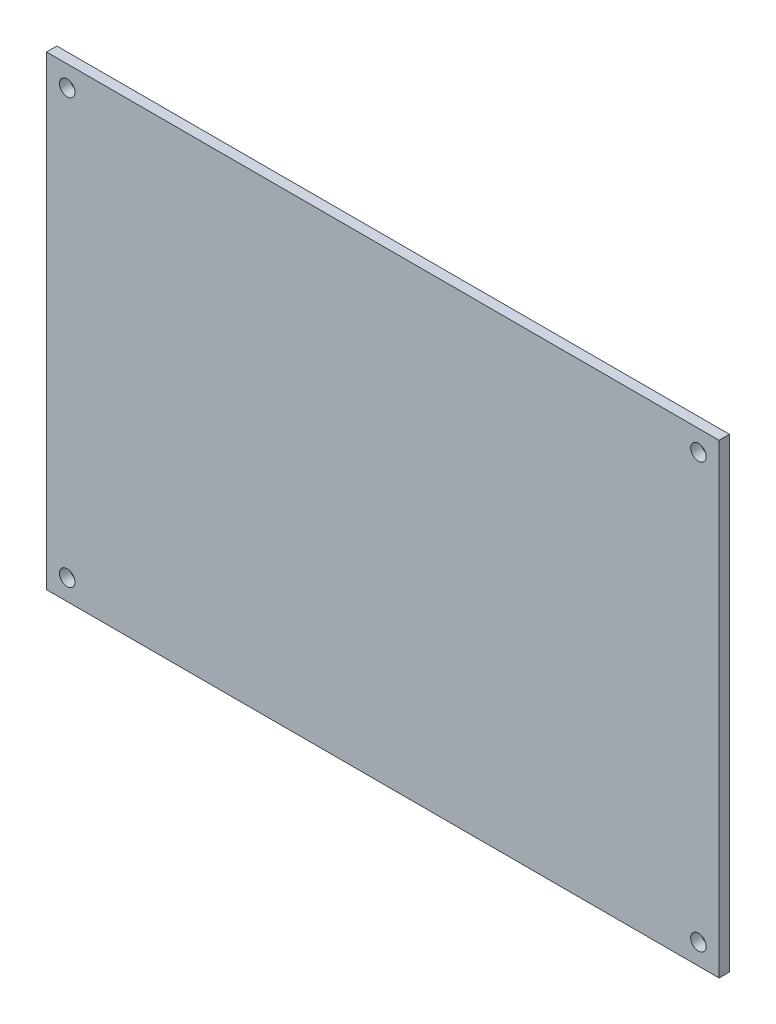
ISO-10303-21;
HEADER;
FILE_DESCRIPTION(('STEP AP214'),'2;1');
FILE_NAME('part.step','',(''),(''),'','','');
FILE_SCHEMA(('AUTOMOTIVE_DESIGN { 1 0 10303 214 1 1 1 1 }'));
ENDSEC;
DATA;
#1=APPLICATION_CONTEXT('core data for automotive mechanical design processes');
#2=APPLICATION_PROTOCOL_DEFINITION('international standard','automotive_design',2000,#1);
#3=PRODUCT_CONTEXT('',#1,'mechanical');
#4=PRODUCT('Part','Part','',(#3));
#5=PRODUCT_RELATED_PRODUCT_CATEGORY('part','',(#4));
#6=PRODUCT_DEFINITION_FORMATION('','',#4);
#7=PRODUCT_DEFINITION_CONTEXT('part definition',#1,'design');
#8=PRODUCT_DEFINITION('design','',#6,#7);
#9=PRODUCT_DEFINITION_SHAPE('','',#8);
#10=(LENGTH_UNIT() NAMED_UNIT(*) SI_UNIT(.MILLI.,.METRE.));
#11=(NAMED_UNIT(*) PLANE_ANGLE_UNIT() SI_UNIT($,.RADIAN.));
#12=(NAMED_UNIT(*) SI_UNIT($,.STERADIAN.) SOLID_ANGLE_UNIT());
#13=UNCERTAINTY_MEASURE_WITH_UNIT(LENGTH_MEASURE(1.E-05),#10,'distance_accuracy_value','');
#14=(GEOMETRIC_REPRESENTATION_CONTEXT(3) GLOBAL_UNCERTAINTY_ASSIGNED_CONTEXT((#13)) GLOBAL_UNIT_ASSIGNED_CONTEXT((#10,
#11,#12)) REPRESENTATION_CONTEXT('',''));
#15=CARTESIAN_POINT('',(0.,0.,0.));
#16=DIRECTION('',(0.,0.,1.));
#17=DIRECTION('',(1.,0.,0.));
#18=AXIS2_PLACEMENT_3D('',#15,#16,#17);
#19=CARTESIAN_POINT('',(0.,114.3,2.54));
#20=DIRECTION('',(0.,0.,-1.));
#21=DIRECTION('',(-1.,0.,0.));
#22=AXIS2_PLACEMENT_3D('',#19,#20,#21);
#23=PLANE('',#22);
#24=CARTESIAN_POINT('',(160.02,5.08,2.54));
#25=DIRECTION('',(0.,0.,1.));
#26=DIRECTION('',(1.,0.,0.));
#27=AXIS2_PLACEMENT_3D('',#24,#25,#26);
#28=CIRCLE('',#27,1.90499999999999);
#29=CARTESIAN_POINT('',(161.925,5.08,2.54));
#30=VERTEX_POINT('',#29);
#31=EDGE_CURVE('E131',#30,#30,#28,.T.);
#32=ORIENTED_EDGE('',*,*,#31,.F.);
#33=EDGE_LOOP('',(#32));
#34=FACE_BOUND('',#33,.T.);
#35=CARTESIAN_POINT('',(5.08,109.22,2.54));
#36=DIRECTION('',(0.,0.,1.));
#37=DIRECTION('',(1.,0.,0.));
#38=AXIS2_PLACEMENT_3D('',#35,#36,#37);
#39=CIRCLE('',#38,1.905);
#40=CARTESIAN_POINT('',(6.985,109.22,2.54));
#41=VERTEX_POINT('',#40);
#42=EDGE_CURVE('E93',#41,#41,#39,.T.);
#43=ORIENTED_EDGE('',*,*,#42,.F.);
#44=EDGE_LOOP('',(#43));
#45=FACE_BOUND('',#44,.T.);
#46=DIRECTION('',(0.,-1.,0.));
#47=VECTOR('',#46,1.);
#48=CARTESIAN_POINT('',(0.,0.,2.54));
#49=LINE('',#48,#47);
#50=CARTESIAN_POINT('',(0.,114.3,2.54));
#51=VERTEX_POINT('',#50);
#52=CARTESIAN_POINT('',(0.,0.,2.54));
#53=VERTEX_POINT('',#52);
#54=EDGE_CURVE('E103',#51,#53,#49,.T.);
#55=ORIENTED_EDGE('',*,*,#54,.T.);
#56=DIRECTION('',(1.,0.,0.));
#57=VECTOR('',#56,1.);
#58=CARTESIAN_POINT('',(0.,0.,2.54));
#59=LINE('',#58,#57);
#60=CARTESIAN_POINT('',(165.1,0.,2.54));
#61=VERTEX_POINT('',#60);
#62=EDGE_CURVE('E88',#53,#61,#59,.T.);
#63=ORIENTED_EDGE('',*,*,#62,.T.);
#64=DIRECTION('',(0.,1.,0.));
#65=VECTOR('',#64,1.);
#66=CARTESIAN_POINT('',(165.1,0.,2.54));
#67=LINE('',#66,#65);
#68=CARTESIAN_POINT('',(165.1,114.3,2.54));
#69=VERTEX_POINT('',#68);
#70=EDGE_CURVE('E54',#61,#69,#67,.T.);
#71=ORIENTED_EDGE('',*,*,#70,.T.);
#72=DIRECTION('',(-1.,0.,0.));
#73=VECTOR('',#72,1.);
#74=CARTESIAN_POINT('',(0.,114.3,2.54));
#75=LINE('',#74,#73);
#76=EDGE_CURVE('E49',#69,#51,#75,.T.);
#77=ORIENTED_EDGE('',*,*,#76,.T.);
#78=EDGE_LOOP('',(#55,#63,#71,#77));
#79=FACE_BOUND('',#78,.T.);
#80=CARTESIAN_POINT('',(160.02,109.22,2.54));
#81=DIRECTION('',(0.,0.,1.));
#82=DIRECTION('',(1.,0.,0.));
#83=AXIS2_PLACEMENT_3D('',#80,#81,#82);
#84=CIRCLE('',#83,1.90499999999999);
#85=CARTESIAN_POINT('',(161.925,109.22,2.54));
#86=VERTEX_POINT('',#85);
#87=EDGE_CURVE('E122',#86,#86,#84,.T.);
#88=ORIENTED_EDGE('',*,*,#87,.F.);
#89=EDGE_LOOP('',(#88));
#90=FACE_BOUND('',#89,.T.);
#91=CARTESIAN_POINT('',(5.08,5.08,2.54));
#92=DIRECTION('',(0.,0.,1.));
#93=DIRECTION('',(1.,0.,0.));
#94=AXIS2_PLACEMENT_3D('',#91,#92,#93);
#95=CIRCLE('',#94,1.905);
#96=CARTESIAN_POINT('',(6.985,5.08,2.54));
#97=VERTEX_POINT('',#96);
#98=EDGE_CURVE('E125',#97,#97,#95,.T.);
#99=ORIENTED_EDGE('',*,*,#98,.F.);
#100=EDGE_LOOP('',(#99));
#101=FACE_BOUND('',#100,.T.);
#102=ADVANCED_FACE('F34',(#34,#45,#79,#90,#101),#23,.F.);
#103=CARTESIAN_POINT('',(0.,114.3,0.));
#104=DIRECTION('',(0.,0.,-1.));
#105=DIRECTION('',(-1.,0.,0.));
#106=AXIS2_PLACEMENT_3D('',#103,#104,#105);
#107=PLANE('',#106);
#108=CARTESIAN_POINT('',(160.02,5.08,0.));
#109=DIRECTION('',(0.,0.,1.));
#110=DIRECTION('',(1.,0.,0.));
#111=AXIS2_PLACEMENT_3D('',#108,#109,#110);
#112=CIRCLE('',#111,1.90499999999999);
#113=CARTESIAN_POINT('',(161.925,5.08,0.));
#114=VERTEX_POINT('',#113);
#115=EDGE_CURVE('E127',#114,#114,#112,.T.);
#116=ORIENTED_EDGE('',*,*,#115,.T.);
#117=EDGE_LOOP('',(#116));
#118=FACE_BOUND('',#117,.T.);
#119=CARTESIAN_POINT('',(5.08,109.22,0.));
#120=DIRECTION('',(0.,0.,1.));
#121=DIRECTION('',(1.,0.,0.));
#122=AXIS2_PLACEMENT_3D('',#119,#120,#121);
#123=CIRCLE('',#122,1.905);
#124=CARTESIAN_POINT('',(6.985,109.22,0.));
#125=VERTEX_POINT('',#124);
#126=EDGE_CURVE('E96',#125,#125,#123,.T.);
#127=ORIENTED_EDGE('',*,*,#126,.T.);
#128=EDGE_LOOP('',(#127));
#129=FACE_BOUND('',#128,.T.);
#130=DIRECTION('',(0.,-1.,0.));
#131=VECTOR('',#130,1.);
#132=CARTESIAN_POINT('',(0.,0.,0.));
#133=LINE('',#132,#131);
#134=CARTESIAN_POINT('',(0.,114.3,0.));
#135=VERTEX_POINT('',#134);
#136=CARTESIAN_POINT('',(0.,0.,0.));
#137=VERTEX_POINT('',#136);
#138=EDGE_CURVE('E80',#135,#137,#133,.T.);
#139=ORIENTED_EDGE('',*,*,#138,.F.);
#140=DIRECTION('',(-1.,0.,0.));
#141=VECTOR('',#140,1.);
#142=CARTESIAN_POINT('',(0.,114.3,0.));
#143=LINE('',#142,#141);
#144=CARTESIAN_POINT('',(165.1,114.3,0.));
#145=VERTEX_POINT('',#144);
#146=EDGE_CURVE('E101',#145,#135,#143,.T.);
#147=ORIENTED_EDGE('',*,*,#146,.F.);
#148=DIRECTION('',(0.,1.,0.));
#149=VECTOR('',#148,1.);
#150=CARTESIAN_POINT('',(165.1,0.,0.));
#151=LINE('',#150,#149);
#152=CARTESIAN_POINT('',(165.1,0.,0.));
#153=VERTEX_POINT('',#152);
#154=EDGE_CURVE('E81',#153,#145,#151,.T.);
#155=ORIENTED_EDGE('',*,*,#154,.F.);
#156=DIRECTION('',(1.,0.,0.));
#157=VECTOR('',#156,1.);
#158=CARTESIAN_POINT('',(0.,0.,0.));
#159=LINE('',#158,#157);
#160=EDGE_CURVE('E75',#137,#153,#159,.T.);
#161=ORIENTED_EDGE('',*,*,#160,.F.);
#162=EDGE_LOOP('',(#139,#147,#155,#161));
#163=FACE_BOUND('',#162,.T.);
#164=CARTESIAN_POINT('',(160.02,109.22,0.));
#165=DIRECTION('',(0.,0.,1.));
#166=DIRECTION('',(1.,0.,0.));
#167=AXIS2_PLACEMENT_3D('',#164,#165,#166);
#168=CIRCLE('',#167,1.90499999999999);
#169=CARTESIAN_POINT('',(161.925,109.22,0.));
#170=VERTEX_POINT('',#169);
#171=EDGE_CURVE('E138',#170,#170,#168,.T.);
#172=ORIENTED_EDGE('',*,*,#171,.T.);
#173=EDGE_LOOP('',(#172));
#174=FACE_BOUND('',#173,.T.);
#175=CARTESIAN_POINT('',(5.08,5.08,0.));
#176=DIRECTION('',(0.,0.,1.));
#177=DIRECTION('',(1.,0.,0.));
#178=AXIS2_PLACEMENT_3D('',#175,#176,#177);
#179=CIRCLE('',#178,1.905);
#180=CARTESIAN_POINT('',(6.985,5.08,0.));
#181=VERTEX_POINT('',#180);
#182=EDGE_CURVE('E128',#181,#181,#179,.T.);
#183=ORIENTED_EDGE('',*,*,#182,.T.);
#184=EDGE_LOOP('',(#183));
#185=FACE_BOUND('',#184,.T.);
#186=ADVANCED_FACE('F76',(#118,#129,#163,#174,#185),#107,.T.);
#187=CARTESIAN_POINT('',(0.,0.,2.54));
#188=DIRECTION('',(1.,0.,0.));
#189=DIRECTION('',(0.,0.,-1.));
#190=AXIS2_PLACEMENT_3D('',#187,#188,#189);
#191=PLANE('',#190);
#192=ORIENTED_EDGE('',*,*,#138,.T.);
#193=DIRECTION('',(0.,0.,-1.));
#194=VECTOR('',#193,1.);
#195=CARTESIAN_POINT('',(0.,0.,2.54));
#196=LINE('',#195,#194);
#197=EDGE_CURVE('E11',#53,#137,#196,.T.);
#198=ORIENTED_EDGE('',*,*,#197,.F.);
#199=ORIENTED_EDGE('',*,*,#54,.F.);
#200=DIRECTION('',(0.,0.,-1.));
#201=VECTOR('',#200,1.);
#202=CARTESIAN_POINT('',(0.,114.3,2.54));
#203=LINE('',#202,#201);
#204=EDGE_CURVE('E92',#51,#135,#203,.T.);
#205=ORIENTED_EDGE('',*,*,#204,.T.);
#206=EDGE_LOOP('',(#192,#198,#199,#205));
#207=FACE_BOUND('',#206,.T.);
#208=ADVANCED_FACE('F36',(#207),#191,.F.);
#209=CARTESIAN_POINT('',(0.,0.,2.54));
#210=DIRECTION('',(0.,1.,0.));
#211=DIRECTION('',(0.,0.,1.));
#212=AXIS2_PLACEMENT_3D('',#209,#210,#211);
#213=PLANE('',#212);
#214=ORIENTED_EDGE('',*,*,#160,.T.);
#215=DIRECTION('',(0.,0.,-1.));
#216=VECTOR('',#215,1.);
#217=CARTESIAN_POINT('',(165.1,0.,2.54));
#218=LINE('',#217,#216);
#219=EDGE_CURVE('E42',#61,#153,#218,.T.);
#220=ORIENTED_EDGE('',*,*,#219,.F.);
#221=ORIENTED_EDGE('',*,*,#62,.F.);
#222=ORIENTED_EDGE('',*,*,#197,.T.);
#223=EDGE_LOOP('',(#214,#220,#221,#222));
#224=FACE_BOUND('',#223,.T.);
#225=ADVANCED_FACE('F87',(#224),#213,.F.);
#226=CARTESIAN_POINT('',(165.1,0.,2.54));
#227=DIRECTION('',(-1.,0.,0.));
#228=DIRECTION('',(0.,0.,1.));
#229=AXIS2_PLACEMENT_3D('',#226,#227,#228);
#230=PLANE('',#229);
#231=ORIENTED_EDGE('',*,*,#154,.T.);
#232=DIRECTION('',(0.,0.,-1.));
#233=VECTOR('',#232,1.);
#234=CARTESIAN_POINT('',(165.1,114.3,2.54));
#235=LINE('',#234,#233);
#236=EDGE_CURVE('E109',#69,#145,#235,.T.);
#237=ORIENTED_EDGE('',*,*,#236,.F.);
#238=ORIENTED_EDGE('',*,*,#70,.F.);
#239=ORIENTED_EDGE('',*,*,#219,.T.);
#240=EDGE_LOOP('',(#231,#237,#238,#239));
#241=FACE_BOUND('',#240,.T.);
#242=ADVANCED_FACE('F112',(#241),#230,.F.);
#243=CARTESIAN_POINT('',(0.,114.3,2.54));
#244=DIRECTION('',(0.,-1.,0.));
#245=DIRECTION('',(0.,0.,-1.));
#246=AXIS2_PLACEMENT_3D('',#243,#244,#245);
#247=PLANE('',#246);
#248=ORIENTED_EDGE('',*,*,#146,.T.);
#249=ORIENTED_EDGE('',*,*,#204,.F.);
#250=ORIENTED_EDGE('',*,*,#76,.F.);
#251=ORIENTED_EDGE('',*,*,#236,.T.);
#252=EDGE_LOOP('',(#248,#249,#250,#251));
#253=FACE_BOUND('',#252,.T.);
#254=ADVANCED_FACE('F114',(#253),#247,.F.);
#255=CARTESIAN_POINT('',(5.08,109.22,2.54));
#256=DIRECTION('',(0.,0.,-1.));
#257=DIRECTION('',(-1.,0.,0.));
#258=AXIS2_PLACEMENT_3D('',#255,#256,#257);
#259=CYLINDRICAL_SURFACE('',#258,1.905);
#260=ORIENTED_EDGE('',*,*,#42,.T.);
#261=EDGE_LOOP('',(#260));
#262=FACE_BOUND('',#261,.T.);
#263=ORIENTED_EDGE('',*,*,#126,.F.);
#264=EDGE_LOOP('',(#263));
#265=FACE_BOUND('',#264,.T.);
#266=ADVANCED_FACE('F145',(#262,#265),#259,.F.);
#267=CARTESIAN_POINT('',(160.02,109.22,2.54));
#268=DIRECTION('',(0.,0.,-1.));
#269=DIRECTION('',(-1.,0.,0.));
#270=AXIS2_PLACEMENT_3D('',#267,#268,#269);
#271=CYLINDRICAL_SURFACE('',#270,1.90499999999999);
#272=ORIENTED_EDGE('',*,*,#87,.T.);
#273=EDGE_LOOP('',(#272));
#274=FACE_BOUND('',#273,.T.);
#275=ORIENTED_EDGE('',*,*,#171,.F.);
#276=EDGE_LOOP('',(#275));
#277=FACE_BOUND('',#276,.T.);
#278=ADVANCED_FACE('F147',(#274,#277),#271,.F.);
#279=CARTESIAN_POINT('',(160.02,5.08,2.54));
#280=DIRECTION('',(0.,0.,-1.));
#281=DIRECTION('',(-1.,0.,0.));
#282=AXIS2_PLACEMENT_3D('',#279,#280,#281);
#283=CYLINDRICAL_SURFACE('',#282,1.90499999999999);
#284=ORIENTED_EDGE('',*,*,#31,.T.);
#285=EDGE_LOOP('',(#284));
#286=FACE_BOUND('',#285,.T.);
#287=ORIENTED_EDGE('',*,*,#115,.F.);
#288=EDGE_LOOP('',(#287));
#289=FACE_BOUND('',#288,.T.);
#290=ADVANCED_FACE('F154',(#286,#289),#283,.F.);
#291=CARTESIAN_POINT('',(5.08,5.08,2.54));
#292=DIRECTION('',(0.,0.,-1.));
#293=DIRECTION('',(-1.,0.,0.));
#294=AXIS2_PLACEMENT_3D('',#291,#292,#293);
#295=CYLINDRICAL_SURFACE('',#294,1.905);
#296=ORIENTED_EDGE('',*,*,#98,.T.);
#297=EDGE_LOOP('',(#296));
#298=FACE_BOUND('',#297,.T.);
#299=ORIENTED_EDGE('',*,*,#182,.F.);
#300=EDGE_LOOP('',(#299));
#301=FACE_BOUND('',#300,.T.);
#302=ADVANCED_FACE('F215',(#298,#301),#295,.F.);
#303=CLOSED_SHELL('',(#102,#186,#208,#225,#242,#254,#266,#278,#290,#302));
#304=MANIFOLD_SOLID_BREP('B2',#303);
#305=ADVANCED_BREP_SHAPE_REPRESENTATION('',(#18,#304),#14);
#306=SHAPE_DEFINITION_REPRESENTATION(#9,#305);
ENDSEC;
END-ISO-10303-21;
